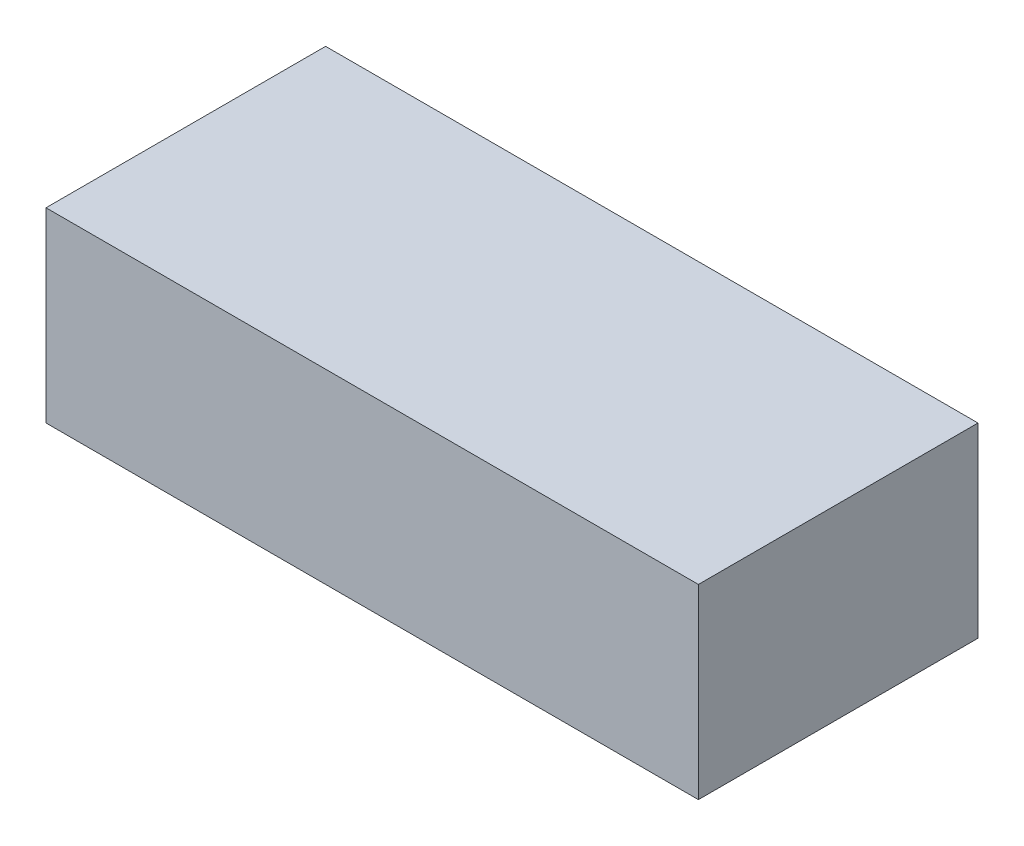
ISO-10303-21;
HEADER;
FILE_DESCRIPTION(('STEP AP214'),'2;1');
FILE_NAME('part.step','',(''),(''),'','','');
FILE_SCHEMA(('AUTOMOTIVE_DESIGN { 1 0 10303 214 1 1 1 1 }'));
ENDSEC;
DATA;
#1=APPLICATION_CONTEXT('core data for automotive mechanical design processes');
#2=APPLICATION_PROTOCOL_DEFINITION('international standard','automotive_design',2000,#1);
#3=PRODUCT_CONTEXT('',#1,'mechanical');
#4=PRODUCT('Part','Part','',(#3));
#5=PRODUCT_RELATED_PRODUCT_CATEGORY('part','',(#4));
#6=PRODUCT_DEFINITION_FORMATION('','',#4);
#7=PRODUCT_DEFINITION_CONTEXT('part definition',#1,'design');
#8=PRODUCT_DEFINITION('design','',#6,#7);
#9=PRODUCT_DEFINITION_SHAPE('','',#8);
#10=(LENGTH_UNIT() NAMED_UNIT(*) SI_UNIT(.MILLI.,.METRE.));
#11=(NAMED_UNIT(*) PLANE_ANGLE_UNIT() SI_UNIT($,.RADIAN.));
#12=(NAMED_UNIT(*) SI_UNIT($,.STERADIAN.) SOLID_ANGLE_UNIT());
#13=UNCERTAINTY_MEASURE_WITH_UNIT(LENGTH_MEASURE(1.E-05),#10,'distance_accuracy_value','');
#14=(GEOMETRIC_REPRESENTATION_CONTEXT(3) GLOBAL_UNCERTAINTY_ASSIGNED_CONTEXT((#13)) GLOBAL_UNIT_ASSIGNED_CONTEXT((#10,
#11,#12)) REPRESENTATION_CONTEXT('',''));
#15=CARTESIAN_POINT('',(0.,0.,0.));
#16=DIRECTION('',(0.,0.,1.));
#17=DIRECTION('',(1.,0.,0.));
#18=AXIS2_PLACEMENT_3D('',#15,#16,#17);
#19=CARTESIAN_POINT('',(14.,8.,-6.));
#20=DIRECTION('',(-1.,0.,0.));
#21=DIRECTION('',(0.,0.,1.));
#22=AXIS2_PLACEMENT_3D('',#19,#20,#21);
#23=PLANE('',#22);
#24=DIRECTION('',(0.,0.,-1.));
#25=VECTOR('',#24,1.);
#26=CARTESIAN_POINT('',(14.,0.,-6.));
#27=LINE('',#26,#25);
#28=CARTESIAN_POINT('',(14.,0.,6.));
#29=VERTEX_POINT('',#28);
#30=CARTESIAN_POINT('',(14.,0.,-6.));
#31=VERTEX_POINT('',#30);
#32=EDGE_CURVE('E96',#29,#31,#27,.T.);
#33=ORIENTED_EDGE('',*,*,#32,.T.);
#34=DIRECTION('',(0.,-1.,0.));
#35=VECTOR('',#34,1.);
#36=CARTESIAN_POINT('',(14.,8.,-6.));
#37=LINE('',#36,#35);
#38=CARTESIAN_POINT('',(14.,8.,-6.));
#39=VERTEX_POINT('',#38);
#40=EDGE_CURVE('E11',#39,#31,#37,.T.);
#41=ORIENTED_EDGE('',*,*,#40,.F.);
#42=DIRECTION('',(0.,0.,-1.));
#43=VECTOR('',#42,1.);
#44=CARTESIAN_POINT('',(14.,8.,-6.));
#45=LINE('',#44,#43);
#46=CARTESIAN_POINT('',(14.,8.,6.));
#47=VERTEX_POINT('',#46);
#48=EDGE_CURVE('E84',#47,#39,#45,.T.);
#49=ORIENTED_EDGE('',*,*,#48,.F.);
#50=DIRECTION('',(0.,-1.,0.));
#51=VECTOR('',#50,1.);
#52=CARTESIAN_POINT('',(14.,8.,6.));
#53=LINE('',#52,#51);
#54=EDGE_CURVE('E92',#47,#29,#53,.T.);
#55=ORIENTED_EDGE('',*,*,#54,.T.);
#56=EDGE_LOOP('',(#33,#41,#49,#55));
#57=FACE_BOUND('',#56,.T.);
#58=ADVANCED_FACE('F33',(#57),#23,.F.);
#59=CARTESIAN_POINT('',(-14.,8.,-6.));
#60=DIRECTION('',(0.,0.,1.));
#61=DIRECTION('',(1.,0.,0.));
#62=AXIS2_PLACEMENT_3D('',#59,#60,#61);
#63=PLANE('',#62);
#64=DIRECTION('',(-1.,0.,0.));
#65=VECTOR('',#64,1.);
#66=CARTESIAN_POINT('',(-14.,0.,-6.));
#67=LINE('',#66,#65);
#68=CARTESIAN_POINT('',(-14.,0.,-6.));
#69=VERTEX_POINT('',#68);
#70=EDGE_CURVE('E88',#31,#69,#67,.T.);
#71=ORIENTED_EDGE('',*,*,#70,.T.);
#72=DIRECTION('',(0.,-1.,0.));
#73=VECTOR('',#72,1.);
#74=CARTESIAN_POINT('',(-14.,8.,-6.));
#75=LINE('',#74,#73);
#76=CARTESIAN_POINT('',(-14.,8.,-6.));
#77=VERTEX_POINT('',#76);
#78=EDGE_CURVE('E41',#77,#69,#75,.T.);
#79=ORIENTED_EDGE('',*,*,#78,.F.);
#80=DIRECTION('',(-1.,0.,0.));
#81=VECTOR('',#80,1.);
#82=CARTESIAN_POINT('',(-14.,8.,-6.));
#83=LINE('',#82,#81);
#84=EDGE_CURVE('E79',#39,#77,#83,.T.);
#85=ORIENTED_EDGE('',*,*,#84,.F.);
#86=ORIENTED_EDGE('',*,*,#40,.T.);
#87=EDGE_LOOP('',(#71,#79,#85,#86));
#88=FACE_BOUND('',#87,.T.);
#89=ADVANCED_FACE('F87',(#88),#63,.F.);
#90=CARTESIAN_POINT('',(-14.,8.,-6.));
#91=DIRECTION('',(1.,0.,0.));
#92=DIRECTION('',(0.,0.,-1.));
#93=AXIS2_PLACEMENT_3D('',#90,#91,#92);
#94=PLANE('',#93);
#95=DIRECTION('',(0.,0.,1.));
#96=VECTOR('',#95,1.);
#97=CARTESIAN_POINT('',(-14.,0.,-6.));
#98=LINE('',#97,#96);
#99=CARTESIAN_POINT('',(-14.,0.,6.));
#100=VERTEX_POINT('',#99);
#101=EDGE_CURVE('E66',#69,#100,#98,.T.);
#102=ORIENTED_EDGE('',*,*,#101,.T.);
#103=DIRECTION('',(0.,-1.,0.));
#104=VECTOR('',#103,1.);
#105=CARTESIAN_POINT('',(-14.,8.,6.));
#106=LINE('',#105,#104);
#107=CARTESIAN_POINT('',(-14.,8.,6.));
#108=VERTEX_POINT('',#107);
#109=EDGE_CURVE('E89',#108,#100,#106,.T.);
#110=ORIENTED_EDGE('',*,*,#109,.F.);
#111=DIRECTION('',(0.,0.,1.));
#112=VECTOR('',#111,1.);
#113=CARTESIAN_POINT('',(-14.,8.,-6.));
#114=LINE('',#113,#112);
#115=EDGE_CURVE('E82',#77,#108,#114,.T.);
#116=ORIENTED_EDGE('',*,*,#115,.F.);
#117=ORIENTED_EDGE('',*,*,#78,.T.);
#118=EDGE_LOOP('',(#102,#110,#116,#117));
#119=FACE_BOUND('',#118,.T.);
#120=ADVANCED_FACE('F90',(#119),#94,.F.);
#121=CARTESIAN_POINT('',(-14.,8.,6.));
#122=DIRECTION('',(0.,0.,-1.));
#123=DIRECTION('',(-1.,0.,0.));
#124=AXIS2_PLACEMENT_3D('',#121,#122,#123);
#125=PLANE('',#124);
#126=DIRECTION('',(1.,0.,0.));
#127=VECTOR('',#126,1.);
#128=CARTESIAN_POINT('',(-14.,0.,6.));
#129=LINE('',#128,#127);
#130=EDGE_CURVE('E72',#100,#29,#129,.T.);
#131=ORIENTED_EDGE('',*,*,#130,.T.);
#132=ORIENTED_EDGE('',*,*,#54,.F.);
#133=DIRECTION('',(1.,0.,0.));
#134=VECTOR('',#133,1.);
#135=CARTESIAN_POINT('',(-14.,8.,6.));
#136=LINE('',#135,#134);
#137=EDGE_CURVE('E49',#108,#47,#136,.T.);
#138=ORIENTED_EDGE('',*,*,#137,.F.);
#139=ORIENTED_EDGE('',*,*,#109,.T.);
#140=EDGE_LOOP('',(#131,#132,#138,#139));
#141=FACE_BOUND('',#140,.T.);
#142=ADVANCED_FACE('F103',(#141),#125,.F.);
#143=CARTESIAN_POINT('',(0.,8.,0.));
#144=DIRECTION('',(0.,1.,0.));
#145=DIRECTION('',(0.,0.,1.));
#146=AXIS2_PLACEMENT_3D('',#143,#144,#145);
#147=PLANE('',#146);
#148=ORIENTED_EDGE('',*,*,#48,.T.);
#149=ORIENTED_EDGE('',*,*,#84,.T.);
#150=ORIENTED_EDGE('',*,*,#115,.T.);
#151=ORIENTED_EDGE('',*,*,#137,.T.);
#152=EDGE_LOOP('',(#148,#149,#150,#151));
#153=FACE_BOUND('',#152,.T.);
#154=ADVANCED_FACE('F80',(#153),#147,.T.);
#155=CARTESIAN_POINT('',(0.,0.,0.));
#156=DIRECTION('',(0.,1.,0.));
#157=DIRECTION('',(0.,0.,1.));
#158=AXIS2_PLACEMENT_3D('',#155,#156,#157);
#159=PLANE('',#158);
#160=ORIENTED_EDGE('',*,*,#32,.F.);
#161=ORIENTED_EDGE('',*,*,#130,.F.);
#162=ORIENTED_EDGE('',*,*,#101,.F.);
#163=ORIENTED_EDGE('',*,*,#70,.F.);
#164=EDGE_LOOP('',(#160,#161,#162,#163));
#165=FACE_BOUND('',#164,.T.);
#166=ADVANCED_FACE('F106',(#165),#159,.F.);
#167=CLOSED_SHELL('',(#58,#89,#120,#142,#154,#166));
#168=MANIFOLD_SOLID_BREP('B2',#167);
#169=ADVANCED_BREP_SHAPE_REPRESENTATION('',(#18,#168),#14);
#170=SHAPE_DEFINITION_REPRESENTATION(#9,#169);
ENDSEC;
END-ISO-10303-21;
